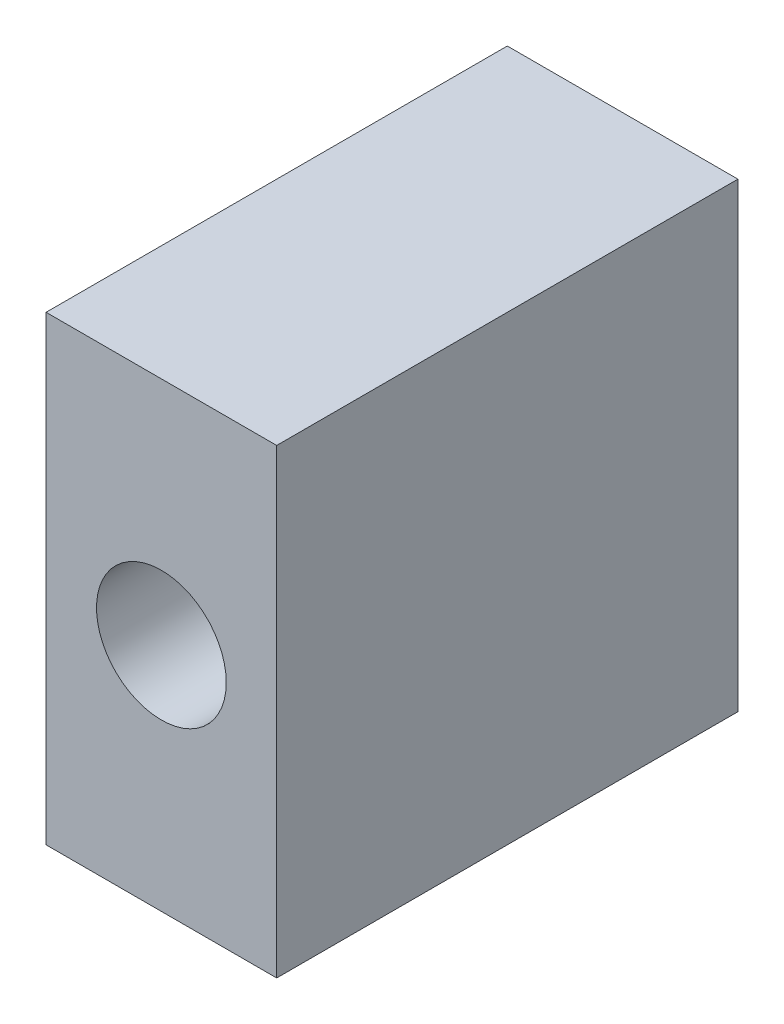
ISO-10303-21;
HEADER;
FILE_DESCRIPTION(('STEP AP214'),'2;1');
FILE_NAME('part.step','',(''),(''),'','','');
FILE_SCHEMA(('AUTOMOTIVE_DESIGN { 1 0 10303 214 1 1 1 1 }'));
ENDSEC;
DATA;
#1=APPLICATION_CONTEXT('core data for automotive mechanical design processes');
#2=APPLICATION_PROTOCOL_DEFINITION('international standard','automotive_design',2000,#1);
#3=PRODUCT_CONTEXT('',#1,'mechanical');
#4=PRODUCT('Part','Part','',(#3));
#5=PRODUCT_RELATED_PRODUCT_CATEGORY('part','',(#4));
#6=PRODUCT_DEFINITION_FORMATION('','',#4);
#7=PRODUCT_DEFINITION_CONTEXT('part definition',#1,'design');
#8=PRODUCT_DEFINITION('design','',#6,#7);
#9=PRODUCT_DEFINITION_SHAPE('','',#8);
#10=(LENGTH_UNIT() NAMED_UNIT(*) SI_UNIT(.MILLI.,.METRE.));
#11=(NAMED_UNIT(*) PLANE_ANGLE_UNIT() SI_UNIT($,.RADIAN.));
#12=(NAMED_UNIT(*) SI_UNIT($,.STERADIAN.) SOLID_ANGLE_UNIT());
#13=UNCERTAINTY_MEASURE_WITH_UNIT(LENGTH_MEASURE(1.E-05),#10,'distance_accuracy_value','');
#14=(GEOMETRIC_REPRESENTATION_CONTEXT(3) GLOBAL_UNCERTAINTY_ASSIGNED_CONTEXT((#13)) GLOBAL_UNIT_ASSIGNED_CONTEXT((#10,
#11,#12)) REPRESENTATION_CONTEXT('',''));
#15=CARTESIAN_POINT('',(0.,0.,0.));
#16=DIRECTION('',(0.,0.,1.));
#17=DIRECTION('',(1.,0.,0.));
#18=AXIS2_PLACEMENT_3D('',#15,#16,#17);
#19=CARTESIAN_POINT('',(0.,0.,8.));
#20=DIRECTION('',(0.,0.,1.));
#21=DIRECTION('',(1.,0.,0.));
#22=AXIS2_PLACEMENT_3D('',#19,#20,#21);
#23=PLANE('',#22);
#24=DIRECTION('',(0.,-1.,0.));
#25=VECTOR('',#24,1.);
#26=CARTESIAN_POINT('',(-2.,4.,8.));
#27=LINE('',#26,#25);
#28=CARTESIAN_POINT('',(-2.,4.,8.));
#29=VERTEX_POINT('',#28);
#30=CARTESIAN_POINT('',(-2.,-4.,8.));
#31=VERTEX_POINT('',#30);
#32=EDGE_CURVE('E92',#29,#31,#27,.T.);
#33=ORIENTED_EDGE('',*,*,#32,.T.);
#34=DIRECTION('',(1.,0.,0.));
#35=VECTOR('',#34,1.);
#36=CARTESIAN_POINT('',(-2.,-4.,8.));
#37=LINE('',#36,#35);
#38=CARTESIAN_POINT('',(2.,-4.,8.));
#39=VERTEX_POINT('',#38);
#40=EDGE_CURVE('E87',#31,#39,#37,.T.);
#41=ORIENTED_EDGE('',*,*,#40,.T.);
#42=DIRECTION('',(0.,1.,0.));
#43=VECTOR('',#42,1.);
#44=CARTESIAN_POINT('',(2.,4.,8.));
#45=LINE('',#44,#43);
#46=CARTESIAN_POINT('',(2.,4.,8.));
#47=VERTEX_POINT('',#46);
#48=EDGE_CURVE('E90',#39,#47,#45,.T.);
#49=ORIENTED_EDGE('',*,*,#48,.T.);
#50=DIRECTION('',(-1.,0.,0.));
#51=VECTOR('',#50,1.);
#52=CARTESIAN_POINT('',(-2.,4.,8.));
#53=LINE('',#52,#51);
#54=EDGE_CURVE('E57',#47,#29,#53,.T.);
#55=ORIENTED_EDGE('',*,*,#54,.T.);
#56=EDGE_LOOP('',(#33,#41,#49,#55));
#57=FACE_BOUND('',#56,.T.);
#58=CARTESIAN_POINT('',(0.,0.,8.));
#59=DIRECTION('',(0.,0.,1.));
#60=DIRECTION('',(1.,0.,0.));
#61=AXIS2_PLACEMENT_3D('',#58,#59,#60);
#62=CIRCLE('',#61,1.125);
#63=CARTESIAN_POINT('',(1.125,0.,8.));
#64=VERTEX_POINT('',#63);
#65=EDGE_CURVE('E112',#64,#64,#62,.T.);
#66=ORIENTED_EDGE('',*,*,#65,.F.);
#67=EDGE_LOOP('',(#66));
#68=FACE_BOUND('',#67,.T.);
#69=ADVANCED_FACE('F39',(#57,#68),#23,.T.);
#70=CARTESIAN_POINT('',(0.,0.,0.));
#71=DIRECTION('',(0.,0.,1.));
#72=DIRECTION('',(1.,0.,0.));
#73=AXIS2_PLACEMENT_3D('',#70,#71,#72);
#74=PLANE('',#73);
#75=DIRECTION('',(0.,-1.,0.));
#76=VECTOR('',#75,1.);
#77=CARTESIAN_POINT('',(-2.,4.,0.));
#78=LINE('',#77,#76);
#79=CARTESIAN_POINT('',(-2.,4.,0.));
#80=VERTEX_POINT('',#79);
#81=CARTESIAN_POINT('',(-2.,-4.,0.));
#82=VERTEX_POINT('',#81);
#83=EDGE_CURVE('E108',#80,#82,#78,.T.);
#84=ORIENTED_EDGE('',*,*,#83,.F.);
#85=DIRECTION('',(-1.,0.,0.));
#86=VECTOR('',#85,1.);
#87=CARTESIAN_POINT('',(-2.,4.,0.));
#88=LINE('',#87,#86);
#89=CARTESIAN_POINT('',(2.,4.,0.));
#90=VERTEX_POINT('',#89);
#91=EDGE_CURVE('E80',#90,#80,#88,.T.);
#92=ORIENTED_EDGE('',*,*,#91,.F.);
#93=DIRECTION('',(0.,1.,0.));
#94=VECTOR('',#93,1.);
#95=CARTESIAN_POINT('',(2.,4.,0.));
#96=LINE('',#95,#94);
#97=CARTESIAN_POINT('',(2.,-4.,0.));
#98=VERTEX_POINT('',#97);
#99=EDGE_CURVE('E74',#98,#90,#96,.T.);
#100=ORIENTED_EDGE('',*,*,#99,.F.);
#101=DIRECTION('',(1.,0.,0.));
#102=VECTOR('',#101,1.);
#103=CARTESIAN_POINT('',(-2.,-4.,0.));
#104=LINE('',#103,#102);
#105=EDGE_CURVE('E97',#82,#98,#104,.T.);
#106=ORIENTED_EDGE('',*,*,#105,.F.);
#107=EDGE_LOOP('',(#84,#92,#100,#106));
#108=FACE_BOUND('',#107,.T.);
#109=CARTESIAN_POINT('',(0.,0.,0.));
#110=DIRECTION('',(0.,0.,1.));
#111=DIRECTION('',(1.,0.,0.));
#112=AXIS2_PLACEMENT_3D('',#109,#110,#111);
#113=CIRCLE('',#112,1.125);
#114=CARTESIAN_POINT('',(1.125,0.,0.));
#115=VERTEX_POINT('',#114);
#116=EDGE_CURVE('E130',#115,#115,#113,.T.);
#117=ORIENTED_EDGE('',*,*,#116,.T.);
#118=EDGE_LOOP('',(#117));
#119=FACE_BOUND('',#118,.T.);
#120=ADVANCED_FACE('F125',(#108,#119),#74,.F.);
#121=CARTESIAN_POINT('',(-2.,4.,8.));
#122=DIRECTION('',(1.,0.,0.));
#123=DIRECTION('',(0.,0.,-1.));
#124=AXIS2_PLACEMENT_3D('',#121,#122,#123);
#125=PLANE('',#124);
#126=ORIENTED_EDGE('',*,*,#83,.T.);
#127=DIRECTION('',(0.,0.,-1.));
#128=VECTOR('',#127,1.);
#129=CARTESIAN_POINT('',(-2.,-4.,8.));
#130=LINE('',#129,#128);
#131=EDGE_CURVE('E11',#31,#82,#130,.T.);
#132=ORIENTED_EDGE('',*,*,#131,.F.);
#133=ORIENTED_EDGE('',*,*,#32,.F.);
#134=DIRECTION('',(0.,0.,-1.));
#135=VECTOR('',#134,1.);
#136=CARTESIAN_POINT('',(-2.,4.,8.));
#137=LINE('',#136,#135);
#138=EDGE_CURVE('E104',#29,#80,#137,.T.);
#139=ORIENTED_EDGE('',*,*,#138,.T.);
#140=EDGE_LOOP('',(#126,#132,#133,#139));
#141=FACE_BOUND('',#140,.T.);
#142=ADVANCED_FACE('F41',(#141),#125,.F.);
#143=CARTESIAN_POINT('',(-2.,-4.,8.));
#144=DIRECTION('',(0.,1.,0.));
#145=DIRECTION('',(0.,0.,1.));
#146=AXIS2_PLACEMENT_3D('',#143,#144,#145);
#147=PLANE('',#146);
#148=ORIENTED_EDGE('',*,*,#105,.T.);
#149=DIRECTION('',(0.,0.,-1.));
#150=VECTOR('',#149,1.);
#151=CARTESIAN_POINT('',(2.,-4.,8.));
#152=LINE('',#151,#150);
#153=EDGE_CURVE('E49',#39,#98,#152,.T.);
#154=ORIENTED_EDGE('',*,*,#153,.F.);
#155=ORIENTED_EDGE('',*,*,#40,.F.);
#156=ORIENTED_EDGE('',*,*,#131,.T.);
#157=EDGE_LOOP('',(#148,#154,#155,#156));
#158=FACE_BOUND('',#157,.T.);
#159=ADVANCED_FACE('F96',(#158),#147,.F.);
#160=CARTESIAN_POINT('',(2.,4.,8.));
#161=DIRECTION('',(-1.,0.,0.));
#162=DIRECTION('',(0.,0.,1.));
#163=AXIS2_PLACEMENT_3D('',#160,#161,#162);
#164=PLANE('',#163);
#165=ORIENTED_EDGE('',*,*,#99,.T.);
#166=DIRECTION('',(0.,0.,-1.));
#167=VECTOR('',#166,1.);
#168=CARTESIAN_POINT('',(2.,4.,8.));
#169=LINE('',#168,#167);
#170=EDGE_CURVE('E99',#47,#90,#169,.T.);
#171=ORIENTED_EDGE('',*,*,#170,.F.);
#172=ORIENTED_EDGE('',*,*,#48,.F.);
#173=ORIENTED_EDGE('',*,*,#153,.T.);
#174=EDGE_LOOP('',(#165,#171,#172,#173));
#175=FACE_BOUND('',#174,.T.);
#176=ADVANCED_FACE('F100',(#175),#164,.F.);
#177=CARTESIAN_POINT('',(-2.,4.,8.));
#178=DIRECTION('',(0.,-1.,0.));
#179=DIRECTION('',(0.,0.,-1.));
#180=AXIS2_PLACEMENT_3D('',#177,#178,#179);
#181=PLANE('',#180);
#182=ORIENTED_EDGE('',*,*,#91,.T.);
#183=ORIENTED_EDGE('',*,*,#138,.F.);
#184=ORIENTED_EDGE('',*,*,#54,.F.);
#185=ORIENTED_EDGE('',*,*,#170,.T.);
#186=EDGE_LOOP('',(#182,#183,#184,#185));
#187=FACE_BOUND('',#186,.T.);
#188=ADVANCED_FACE('F122',(#187),#181,.F.);
#189=CARTESIAN_POINT('',(0.,0.,8.));
#190=DIRECTION('',(0.,0.,-1.));
#191=DIRECTION('',(-1.,0.,0.));
#192=AXIS2_PLACEMENT_3D('',#189,#190,#191);
#193=CYLINDRICAL_SURFACE('',#192,1.125);
#194=ORIENTED_EDGE('',*,*,#65,.T.);
#195=EDGE_LOOP('',(#194));
#196=FACE_BOUND('',#195,.T.);
#197=ORIENTED_EDGE('',*,*,#116,.F.);
#198=EDGE_LOOP('',(#197));
#199=FACE_BOUND('',#198,.T.);
#200=ADVANCED_FACE('F138',(#196,#199),#193,.F.);
#201=CLOSED_SHELL('',(#69,#120,#142,#159,#176,#188,#200));
#202=MANIFOLD_SOLID_BREP('B2',#201);
#203=ADVANCED_BREP_SHAPE_REPRESENTATION('',(#18,#202),#14);
#204=SHAPE_DEFINITION_REPRESENTATION(#9,#203);
ENDSEC;
END-ISO-10303-21;
